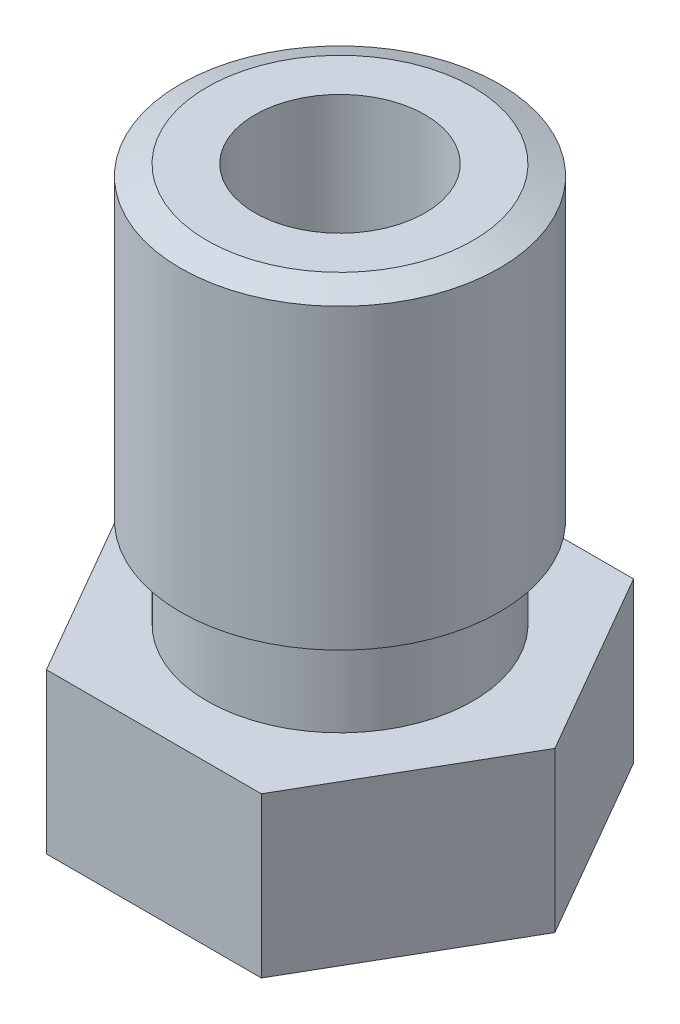
ISO-10303-21;
HEADER;
FILE_DESCRIPTION(('STEP AP214'),'2;1');
FILE_NAME('part.step','',(''),(''),'','','');
FILE_SCHEMA(('AUTOMOTIVE_DESIGN { 1 0 10303 214 1 1 1 1 }'));
ENDSEC;
DATA;
#1=APPLICATION_CONTEXT('core data for automotive mechanical design processes');
#2=APPLICATION_PROTOCOL_DEFINITION('international standard','automotive_design',2000,#1);
#3=PRODUCT_CONTEXT('',#1,'mechanical');
#4=PRODUCT('Part','Part','',(#3));
#5=PRODUCT_RELATED_PRODUCT_CATEGORY('part','',(#4));
#6=PRODUCT_DEFINITION_FORMATION('','',#4);
#7=PRODUCT_DEFINITION_CONTEXT('part definition',#1,'design');
#8=PRODUCT_DEFINITION('design','',#6,#7);
#9=PRODUCT_DEFINITION_SHAPE('','',#8);
#10=(LENGTH_UNIT() NAMED_UNIT(*) SI_UNIT(.MILLI.,.METRE.));
#11=(NAMED_UNIT(*) PLANE_ANGLE_UNIT() SI_UNIT($,.RADIAN.));
#12=(NAMED_UNIT(*) SI_UNIT($,.STERADIAN.) SOLID_ANGLE_UNIT());
#13=UNCERTAINTY_MEASURE_WITH_UNIT(LENGTH_MEASURE(1.E-05),#10,'distance_accuracy_value','');
#14=(GEOMETRIC_REPRESENTATION_CONTEXT(3) GLOBAL_UNCERTAINTY_ASSIGNED_CONTEXT((#13)) GLOBAL_UNIT_ASSIGNED_CONTEXT((#10,
#11,#12)) REPRESENTATION_CONTEXT('',''));
#15=CARTESIAN_POINT('',(0.,0.,0.));
#16=DIRECTION('',(0.,0.,1.));
#17=DIRECTION('',(1.,0.,0.));
#18=AXIS2_PLACEMENT_3D('',#15,#16,#17);
#19=CARTESIAN_POINT('',(3.5,5.,0.));
#20=DIRECTION('',(0.,1.,0.));
#21=DIRECTION('',(0.,0.,1.));
#22=AXIS2_PLACEMENT_3D('',#19,#20,#21);
#23=PLANE('',#22);
#24=CARTESIAN_POINT('',(0.,5.,0.));
#25=DIRECTION('',(0.,-1.,0.));
#26=DIRECTION('',(0.,0.,-1.));
#27=AXIS2_PLACEMENT_3D('',#24,#25,#26);
#28=CIRCLE('',#27,2.5);
#29=CARTESIAN_POINT('',(0.,5.,-2.5));
#30=VERTEX_POINT('',#29);
#31=EDGE_CURVE('E129',#30,#30,#28,.T.);
#32=ORIENTED_EDGE('',*,*,#31,.T.);
#33=EDGE_LOOP('',(#32));
#34=FACE_BOUND('',#33,.T.);
#35=DIRECTION('',(0.5,0.,-0.866025403784439));
#36=VECTOR('',#35,1.);
#37=CARTESIAN_POINT('',(2.02072594216369,5.,3.5));
#38=LINE('',#37,#36);
#39=CARTESIAN_POINT('',(2.02072594216369,5.,3.5));
#40=VERTEX_POINT('',#39);
#41=CARTESIAN_POINT('',(4.04145188432738,5.,0.));
#42=VERTEX_POINT('',#41);
#43=EDGE_CURVE('E109',#40,#42,#38,.T.);
#44=ORIENTED_EDGE('',*,*,#43,.T.);
#45=DIRECTION('',(-0.5,0.,-0.866025403784439));
#46=VECTOR('',#45,1.);
#47=CARTESIAN_POINT('',(4.04145188432738,5.,0.));
#48=LINE('',#47,#46);
#49=CARTESIAN_POINT('',(2.02072594216369,5.,-3.5));
#50=VERTEX_POINT('',#49);
#51=EDGE_CURVE('E102',#42,#50,#48,.T.);
#52=ORIENTED_EDGE('',*,*,#51,.T.);
#53=DIRECTION('',(-1.,0.,0.));
#54=VECTOR('',#53,1.);
#55=CARTESIAN_POINT('',(2.02072594216369,5.,-3.5));
#56=LINE('',#55,#54);
#57=CARTESIAN_POINT('',(-2.02072594216369,5.,-3.5));
#58=VERTEX_POINT('',#57);
#59=EDGE_CURVE('E50',#50,#58,#56,.T.);
#60=ORIENTED_EDGE('',*,*,#59,.T.);
#61=DIRECTION('',(-0.5,0.,0.866025403784439));
#62=VECTOR('',#61,1.);
#63=CARTESIAN_POINT('',(-2.02072594216369,5.,-3.5));
#64=LINE('',#63,#62);
#65=CARTESIAN_POINT('',(-4.04145188432738,5.,0.));
#66=VERTEX_POINT('',#65);
#67=EDGE_CURVE('E95',#58,#66,#64,.T.);
#68=ORIENTED_EDGE('',*,*,#67,.T.);
#69=DIRECTION('',(0.5,0.,0.866025403784439));
#70=VECTOR('',#69,1.);
#71=CARTESIAN_POINT('',(-4.04145188432738,5.,0.));
#72=LINE('',#71,#70);
#73=CARTESIAN_POINT('',(-2.02072594216369,5.,3.5));
#74=VERTEX_POINT('',#73);
#75=EDGE_CURVE('E89',#66,#74,#72,.T.);
#76=ORIENTED_EDGE('',*,*,#75,.T.);
#77=DIRECTION('',(1.,0.,0.));
#78=VECTOR('',#77,1.);
#79=CARTESIAN_POINT('',(-2.02072594216369,5.,3.5));
#80=LINE('',#79,#78);
#81=EDGE_CURVE('E232',#74,#40,#80,.T.);
#82=ORIENTED_EDGE('',*,*,#81,.T.);
#83=EDGE_LOOP('',(#44,#52,#60,#68,#76,#82));
#84=FACE_BOUND('',#83,.T.);
#85=ADVANCED_FACE('F33',(#34,#84),#23,.T.);
#86=CARTESIAN_POINT('',(0.,0.,0.));
#87=DIRECTION('',(0.,-1.,0.));
#88=DIRECTION('',(0.,0.,-1.));
#89=AXIS2_PLACEMENT_3D('',#86,#87,#88);
#90=CYLINDRICAL_SURFACE('',#89,2.5);
#91=CARTESIAN_POINT('',(0.,6.5,0.));
#92=DIRECTION('',(0.,-1.,0.));
#93=DIRECTION('',(0.,0.,-1.));
#94=AXIS2_PLACEMENT_3D('',#91,#92,#93);
#95=CIRCLE('',#94,2.5);
#96=CARTESIAN_POINT('',(0.,6.5,-2.5));
#97=VERTEX_POINT('',#96);
#98=EDGE_CURVE('E126',#97,#97,#95,.T.);
#99=ORIENTED_EDGE('',*,*,#98,.T.);
#100=EDGE_LOOP('',(#99));
#101=FACE_BOUND('',#100,.T.);
#102=ORIENTED_EDGE('',*,*,#31,.F.);
#103=EDGE_LOOP('',(#102));
#104=FACE_BOUND('',#103,.T.);
#105=ADVANCED_FACE('F150',(#101,#104),#90,.T.);
#106=CARTESIAN_POINT('',(0.,6.5,0.));
#107=DIRECTION('',(0.,1.,0.));
#108=DIRECTION('',(0.,0.,1.));
#109=AXIS2_PLACEMENT_3D('',#106,#107,#108);
#110=CONICAL_SURFACE('',#109,2.5,1.19028994968253);
#111=CARTESIAN_POINT('',(0.,6.7,0.));
#112=DIRECTION('',(0.,-1.,0.));
#113=DIRECTION('',(0.,0.,-1.));
#114=AXIS2_PLACEMENT_3D('',#111,#112,#113);
#115=CIRCLE('',#114,3.);
#116=CARTESIAN_POINT('',(0.,6.7,-3.));
#117=VERTEX_POINT('',#116);
#118=EDGE_CURVE('E123',#117,#117,#115,.T.);
#119=ORIENTED_EDGE('',*,*,#118,.T.);
#120=EDGE_LOOP('',(#119));
#121=FACE_BOUND('',#120,.T.);
#122=ORIENTED_EDGE('',*,*,#98,.F.);
#123=EDGE_LOOP('',(#122));
#124=FACE_BOUND('',#123,.T.);
#125=ADVANCED_FACE('F155',(#121,#124),#110,.T.);
#126=CARTESIAN_POINT('',(0.,0.,0.));
#127=DIRECTION('',(0.,-1.,0.));
#128=DIRECTION('',(0.,0.,-1.));
#129=AXIS2_PLACEMENT_3D('',#126,#127,#128);
#130=CYLINDRICAL_SURFACE('',#129,3.);
#131=CARTESIAN_POINT('',(0.,12.3,0.));
#132=DIRECTION('',(0.,-1.,0.));
#133=DIRECTION('',(0.,0.,-1.));
#134=AXIS2_PLACEMENT_3D('',#131,#132,#133);
#135=CIRCLE('',#134,3.);
#136=CARTESIAN_POINT('',(0.,12.3,-3.));
#137=VERTEX_POINT('',#136);
#138=EDGE_CURVE('E120',#137,#137,#135,.T.);
#139=ORIENTED_EDGE('',*,*,#138,.T.);
#140=EDGE_LOOP('',(#139));
#141=FACE_BOUND('',#140,.T.);
#142=ORIENTED_EDGE('',*,*,#118,.F.);
#143=EDGE_LOOP('',(#142));
#144=FACE_BOUND('',#143,.T.);
#145=ADVANCED_FACE('F161',(#141,#144),#130,.T.);
#146=CARTESIAN_POINT('',(0.,12.3,0.));
#147=DIRECTION('',(0.,-1.,0.));
#148=DIRECTION('',(0.,0.,-1.));
#149=AXIS2_PLACEMENT_3D('',#146,#147,#148);
#150=CONICAL_SURFACE('',#149,3.,1.19028994968253);
#151=CARTESIAN_POINT('',(0.,12.5,0.));
#152=DIRECTION('',(0.,-1.,0.));
#153=DIRECTION('',(0.,0.,-1.));
#154=AXIS2_PLACEMENT_3D('',#151,#152,#153);
#155=CIRCLE('',#154,2.5);
#156=CARTESIAN_POINT('',(0.,12.5,-2.5));
#157=VERTEX_POINT('',#156);
#158=EDGE_CURVE('E116',#157,#157,#155,.T.);
#159=ORIENTED_EDGE('',*,*,#158,.T.);
#160=EDGE_LOOP('',(#159));
#161=FACE_BOUND('',#160,.T.);
#162=ORIENTED_EDGE('',*,*,#138,.F.);
#163=EDGE_LOOP('',(#162));
#164=FACE_BOUND('',#163,.T.);
#165=ADVANCED_FACE('F165',(#161,#164),#150,.T.);
#166=CARTESIAN_POINT('',(2.5,12.5,0.));
#167=DIRECTION('',(0.,1.,0.));
#168=DIRECTION('',(0.,0.,1.));
#169=AXIS2_PLACEMENT_3D('',#166,#167,#168);
#170=PLANE('',#169);
#171=CARTESIAN_POINT('',(0.,12.5,0.));
#172=DIRECTION('',(0.,-1.,0.));
#173=DIRECTION('',(0.,0.,-1.));
#174=AXIS2_PLACEMENT_3D('',#171,#172,#173);
#175=CIRCLE('',#174,1.6);
#176=CARTESIAN_POINT('',(0.,12.5,-1.6));
#177=VERTEX_POINT('',#176);
#178=EDGE_CURVE('E212',#177,#177,#175,.T.);
#179=ORIENTED_EDGE('',*,*,#178,.T.);
#180=EDGE_LOOP('',(#179));
#181=FACE_BOUND('',#180,.T.);
#182=ORIENTED_EDGE('',*,*,#158,.F.);
#183=EDGE_LOOP('',(#182));
#184=FACE_BOUND('',#183,.T.);
#185=ADVANCED_FACE('F169',(#181,#184),#170,.T.);
#186=CARTESIAN_POINT('',(2.02072594216369,-8.69267662156363,-3.5));
#187=DIRECTION('',(0.,0.,-1.));
#188=DIRECTION('',(-1.,0.,0.));
#189=AXIS2_PLACEMENT_3D('',#186,#187,#188);
#190=PLANE('',#189);
#191=ORIENTED_EDGE('',*,*,#59,.F.);
#192=DIRECTION('',(0.,1.,0.));
#193=VECTOR('',#192,1.);
#194=CARTESIAN_POINT('',(2.02072594216369,-8.69267662156363,-3.5));
#195=LINE('',#194,#193);
#196=CARTESIAN_POINT('',(2.02072594216369,2.,-3.5));
#197=VERTEX_POINT('',#196);
#198=EDGE_CURVE('E114',#197,#50,#195,.T.);
#199=ORIENTED_EDGE('',*,*,#198,.F.);
#200=DIRECTION('',(-1.,0.,0.));
#201=VECTOR('',#200,1.);
#202=CARTESIAN_POINT('',(2.02072594216369,2.,-3.5));
#203=LINE('',#202,#201);
#204=CARTESIAN_POINT('',(-2.02072594216369,2.,-3.5));
#205=VERTEX_POINT('',#204);
#206=EDGE_CURVE('E106',#197,#205,#203,.T.);
#207=ORIENTED_EDGE('',*,*,#206,.T.);
#208=DIRECTION('',(0.,1.,0.));
#209=VECTOR('',#208,1.);
#210=CARTESIAN_POINT('',(-2.02072594216369,-8.69267662156363,-3.5));
#211=LINE('',#210,#209);
#212=EDGE_CURVE('E97',#205,#58,#211,.T.);
#213=ORIENTED_EDGE('',*,*,#212,.T.);
#214=EDGE_LOOP('',(#191,#199,#207,#213));
#215=FACE_BOUND('',#214,.T.);
#216=ADVANCED_FACE('F105',(#215),#190,.T.);
#217=CARTESIAN_POINT('',(-2.02072594216369,-8.69267662156363,-3.5));
#218=DIRECTION('',(-0.866025403784439,0.,-0.5));
#219=DIRECTION('',(-0.5,0.,0.866025403784439));
#220=AXIS2_PLACEMENT_3D('',#217,#218,#219);
#221=PLANE('',#220);
#222=ORIENTED_EDGE('',*,*,#67,.F.);
#223=ORIENTED_EDGE('',*,*,#212,.F.);
#224=DIRECTION('',(-0.5,0.,0.866025403784439));
#225=VECTOR('',#224,1.);
#226=CARTESIAN_POINT('',(-2.02072594216369,2.,-3.5));
#227=LINE('',#226,#225);
#228=CARTESIAN_POINT('',(-4.04145188432738,2.,0.));
#229=VERTEX_POINT('',#228);
#230=EDGE_CURVE('E77',#205,#229,#227,.T.);
#231=ORIENTED_EDGE('',*,*,#230,.T.);
#232=DIRECTION('',(0.,1.,0.));
#233=VECTOR('',#232,1.);
#234=CARTESIAN_POINT('',(-4.04145188432738,-8.69267662156363,0.));
#235=LINE('',#234,#233);
#236=EDGE_CURVE('E98',#229,#66,#235,.T.);
#237=ORIENTED_EDGE('',*,*,#236,.T.);
#238=EDGE_LOOP('',(#222,#223,#231,#237));
#239=FACE_BOUND('',#238,.T.);
#240=ADVANCED_FACE('F96',(#239),#221,.T.);
#241=CARTESIAN_POINT('',(-4.04145188432738,-8.69267662156363,0.));
#242=DIRECTION('',(-0.866025403784438,0.,0.5));
#243=DIRECTION('',(0.5,0.,0.866025403784439));
#244=AXIS2_PLACEMENT_3D('',#241,#242,#243);
#245=PLANE('',#244);
#246=ORIENTED_EDGE('',*,*,#75,.F.);
#247=ORIENTED_EDGE('',*,*,#236,.F.);
#248=DIRECTION('',(0.5,0.,0.866025403784439));
#249=VECTOR('',#248,1.);
#250=CARTESIAN_POINT('',(-4.04145188432738,2.,0.));
#251=LINE('',#250,#249);
#252=CARTESIAN_POINT('',(-2.02072594216369,2.,3.5));
#253=VERTEX_POINT('',#252);
#254=EDGE_CURVE('E73',#229,#253,#251,.T.);
#255=ORIENTED_EDGE('',*,*,#254,.T.);
#256=DIRECTION('',(0.,1.,0.));
#257=VECTOR('',#256,1.);
#258=CARTESIAN_POINT('',(-2.02072594216369,-8.69267662156363,3.5));
#259=LINE('',#258,#257);
#260=EDGE_CURVE('E246',#253,#74,#259,.T.);
#261=ORIENTED_EDGE('',*,*,#260,.T.);
#262=EDGE_LOOP('',(#246,#247,#255,#261));
#263=FACE_BOUND('',#262,.T.);
#264=ADVANCED_FACE('F178',(#263),#245,.T.);
#265=CARTESIAN_POINT('',(-2.02072594216369,-8.69267662156363,3.5));
#266=DIRECTION('',(0.,0.,1.));
#267=DIRECTION('',(1.,0.,0.));
#268=AXIS2_PLACEMENT_3D('',#265,#266,#267);
#269=PLANE('',#268);
#270=DIRECTION('',(0.,1.,0.));
#271=VECTOR('',#270,1.);
#272=CARTESIAN_POINT('',(2.02072594216369,-8.69267662156363,3.5));
#273=LINE('',#272,#271);
#274=CARTESIAN_POINT('',(2.02072594216369,2.,3.5));
#275=VERTEX_POINT('',#274);
#276=EDGE_CURVE('E242',#275,#40,#273,.T.);
#277=ORIENTED_EDGE('',*,*,#276,.T.);
#278=ORIENTED_EDGE('',*,*,#81,.F.);
#279=ORIENTED_EDGE('',*,*,#260,.F.);
#280=DIRECTION('',(1.,0.,0.));
#281=VECTOR('',#280,1.);
#282=CARTESIAN_POINT('',(-2.02072594216369,2.,3.5));
#283=LINE('',#282,#281);
#284=EDGE_CURVE('E243',#253,#275,#283,.T.);
#285=ORIENTED_EDGE('',*,*,#284,.T.);
#286=EDGE_LOOP('',(#277,#278,#279,#285));
#287=FACE_BOUND('',#286,.T.);
#288=ADVANCED_FACE('F181',(#287),#269,.T.);
#289=CARTESIAN_POINT('',(2.02072594216369,-8.69267662156363,3.5));
#290=DIRECTION('',(0.866025403784439,0.,0.5));
#291=DIRECTION('',(0.5,0.,-0.866025403784439));
#292=AXIS2_PLACEMENT_3D('',#289,#290,#291);
#293=PLANE('',#292);
#294=ORIENTED_EDGE('',*,*,#43,.F.);
#295=ORIENTED_EDGE('',*,*,#276,.F.);
#296=DIRECTION('',(0.5,0.,-0.866025403784439));
#297=VECTOR('',#296,1.);
#298=CARTESIAN_POINT('',(2.02072594216369,2.,3.5));
#299=LINE('',#298,#297);
#300=CARTESIAN_POINT('',(4.04145188432738,2.,0.));
#301=VERTEX_POINT('',#300);
#302=EDGE_CURVE('E239',#275,#301,#299,.T.);
#303=ORIENTED_EDGE('',*,*,#302,.T.);
#304=DIRECTION('',(0.,1.,0.));
#305=VECTOR('',#304,1.);
#306=CARTESIAN_POINT('',(4.04145188432738,-8.69267662156363,0.));
#307=LINE('',#306,#305);
#308=EDGE_CURVE('E238',#301,#42,#307,.T.);
#309=ORIENTED_EDGE('',*,*,#308,.T.);
#310=EDGE_LOOP('',(#294,#295,#303,#309));
#311=FACE_BOUND('',#310,.T.);
#312=ADVANCED_FACE('F184',(#311),#293,.T.);
#313=CARTESIAN_POINT('',(4.04145188432738,-8.69267662156363,0.));
#314=DIRECTION('',(0.866025403784438,0.,-0.5));
#315=DIRECTION('',(-0.5,0.,-0.866025403784439));
#316=AXIS2_PLACEMENT_3D('',#313,#314,#315);
#317=PLANE('',#316);
#318=ORIENTED_EDGE('',*,*,#51,.F.);
#319=ORIENTED_EDGE('',*,*,#308,.F.);
#320=DIRECTION('',(-0.5,0.,-0.866025403784439));
#321=VECTOR('',#320,1.);
#322=CARTESIAN_POINT('',(4.04145188432738,2.,0.));
#323=LINE('',#322,#321);
#324=EDGE_CURVE('E117',#301,#197,#323,.T.);
#325=ORIENTED_EDGE('',*,*,#324,.T.);
#326=ORIENTED_EDGE('',*,*,#198,.T.);
#327=EDGE_LOOP('',(#318,#319,#325,#326));
#328=FACE_BOUND('',#327,.T.);
#329=ADVANCED_FACE('F188',(#328),#317,.T.);
#330=CARTESIAN_POINT('',(0.,0.,0.));
#331=DIRECTION('',(0.,-1.,0.));
#332=DIRECTION('',(0.,0.,-1.));
#333=AXIS2_PLACEMENT_3D('',#330,#331,#332);
#334=PLANE('',#333);
#335=CARTESIAN_POINT('',(0.,0.,0.));
#336=DIRECTION('',(0.,-1.,0.));
#337=DIRECTION('',(0.,0.,-1.));
#338=AXIS2_PLACEMENT_3D('',#335,#336,#337);
#339=CIRCLE('',#338,0.2);
#340=CARTESIAN_POINT('',(0.,0.,-0.2));
#341=VERTEX_POINT('',#340);
#342=EDGE_CURVE('E228',#341,#341,#339,.T.);
#343=ORIENTED_EDGE('',*,*,#342,.F.);
#344=EDGE_LOOP('',(#343));
#345=FACE_BOUND('',#344,.T.);
#346=CARTESIAN_POINT('',(0.,0.,0.));
#347=DIRECTION('',(0.,-1.,0.));
#348=DIRECTION('',(0.,0.,-1.));
#349=AXIS2_PLACEMENT_3D('',#346,#347,#348);
#350=CIRCLE('',#349,0.5);
#351=CARTESIAN_POINT('',(0.,0.,0.5));
#352=VERTEX_POINT('',#351);
#353=EDGE_CURVE('E11',#352,#352,#350,.T.);
#354=ORIENTED_EDGE('',*,*,#353,.T.);
#355=EDGE_LOOP('',(#354));
#356=FACE_BOUND('',#355,.T.);
#357=ADVANCED_FACE('F35',(#345,#356),#334,.T.);
#358=CARTESIAN_POINT('',(0.,0.,0.));
#359=DIRECTION('',(0.,1.,0.));
#360=DIRECTION('',(0.,0.,1.));
#361=AXIS2_PLACEMENT_3D('',#358,#359,#360);
#362=CONICAL_SURFACE('',#361,0.5,0.610865238198013);
#363=CARTESIAN_POINT('',(0.,2.,0.));
#364=DIRECTION('',(0.,-1.,0.));
#365=DIRECTION('',(0.,0.,-1.));
#366=AXIS2_PLACEMENT_3D('',#363,#364,#365);
#367=CIRCLE('',#366,1.90041507641941);
#368=CARTESIAN_POINT('',(0.,2.,1.90041507641941));
#369=VERTEX_POINT('',#368);
#370=EDGE_CURVE('E42',#369,#369,#367,.T.);
#371=CARTESIAN_POINT('',(0.,2.,1.90041507641941));
#372=CARTESIAN_POINT('',(0.,1.97916666666667,1.88582741937338));
#373=CARTESIAN_POINT('',(0.,1.95833333333333,1.87123976232734));
#374=CARTESIAN_POINT('',(0.,1.91666666666667,1.84206444823527));
#375=CARTESIAN_POINT('',(0.,1.89583333333333,1.82747679118923));
#376=CARTESIAN_POINT('',(0.,1.85416666666667,1.79830147709716));
#377=CARTESIAN_POINT('',(0.,1.83333333333333,1.78371382005113));
#378=CARTESIAN_POINT('',(0.,1.79166666666667,1.75453850595906));
#379=CARTESIAN_POINT('',(0.,1.77083333333333,1.73995084891302));
#380=CARTESIAN_POINT('',(0.,1.72916666666667,1.71077553482095));
#381=CARTESIAN_POINT('',(0.,1.70833333333333,1.69618787777491));
#382=CARTESIAN_POINT('',(0.,1.66666666666667,1.66701256368284));
#383=CARTESIAN_POINT('',(0.,1.64583333333333,1.65242490663681));
#384=CARTESIAN_POINT('',(0.,1.60416666666667,1.62324959254474));
#385=CARTESIAN_POINT('',(0.,1.58333333333333,1.6086619354987));
#386=CARTESIAN_POINT('',(0.,1.54166666666667,1.57948662140663));
#387=CARTESIAN_POINT('',(0.,1.52083333333333,1.56489896436059));
#388=CARTESIAN_POINT('',(0.,1.47916666666667,1.53572365026852));
#389=CARTESIAN_POINT('',(0.,1.45833333333333,1.52113599322249));
#390=CARTESIAN_POINT('',(0.,1.41666666666667,1.49196067913042));
#391=CARTESIAN_POINT('',(0.,1.39583333333333,1.47737302208438));
#392=CARTESIAN_POINT('',(0.,1.35416666666667,1.44819770799231));
#393=CARTESIAN_POINT('',(0.,1.33333333333333,1.43361005094627));
#394=CARTESIAN_POINT('',(0.,1.29166666666667,1.4044347368542));
#395=CARTESIAN_POINT('',(0.,1.27083333333333,1.38984707980817));
#396=CARTESIAN_POINT('',(0.,1.22916666666667,1.3606717657161));
#397=CARTESIAN_POINT('',(0.,1.20833333333333,1.34608410867006));
#398=CARTESIAN_POINT('',(0.,1.16666666666667,1.31690879457799));
#399=CARTESIAN_POINT('',(0.,1.14583333333333,1.30232113753195));
#400=CARTESIAN_POINT('',(0.,1.10416666666667,1.27314582343988));
#401=CARTESIAN_POINT('',(0.,1.08333333333333,1.25855816639385));
#402=CARTESIAN_POINT('',(0.,1.04166666666667,1.22938285230178));
#403=CARTESIAN_POINT('',(0.,1.02083333333333,1.21479519525574));
#404=CARTESIAN_POINT('',(0.,0.979166666666667,1.18561988116367));
#405=CARTESIAN_POINT('',(0.,0.958333333333333,1.17103222411763));
#406=CARTESIAN_POINT('',(0.,0.916666666666667,1.14185691002556));
#407=CARTESIAN_POINT('',(0.,0.895833333333333,1.12726925297953));
#408=CARTESIAN_POINT('',(0.,0.854166666666667,1.09809393888746));
#409=CARTESIAN_POINT('',(0.,0.833333333333333,1.08350628184142));
#410=CARTESIAN_POINT('',(0.,0.791666666666667,1.05433096774935));
#411=CARTESIAN_POINT('',(0.,0.770833333333333,1.03974331070331));
#412=CARTESIAN_POINT('',(0.,0.729166666666667,1.01056799661124));
#413=CARTESIAN_POINT('',(0.,0.708333333333333,0.995980339565208));
#414=CARTESIAN_POINT('',(0.,0.666666666666667,0.966805025473137));
#415=CARTESIAN_POINT('',(0.,0.645833333333333,0.952217368427102));
#416=CARTESIAN_POINT('',(0.,0.604166666666667,0.923042054335031));
#417=CARTESIAN_POINT('',(0.,0.583333333333333,0.908454397288995));
#418=CARTESIAN_POINT('',(0.,0.541666666666667,0.879279083196924));
#419=CARTESIAN_POINT('',(0.,0.520833333333333,0.864691426150888));
#420=CARTESIAN_POINT('',(0.,0.479166666666667,0.835516112058817));
#421=CARTESIAN_POINT('',(0.,0.458333333333333,0.820928455012782));
#422=CARTESIAN_POINT('',(0.,0.416666666666667,0.791753140920711));
#423=CARTESIAN_POINT('',(0.,0.395833333333333,0.777165483874675));
#424=CARTESIAN_POINT('',(0.,0.354166666666667,0.747990169782604));
#425=CARTESIAN_POINT('',(0.,0.333333333333333,0.733402512736569));
#426=CARTESIAN_POINT('',(0.,0.291666666666667,0.704227198644498));
#427=CARTESIAN_POINT('',(0.,0.270833333333333,0.689639541598462));
#428=CARTESIAN_POINT('',(0.,0.229166666666667,0.660464227506391));
#429=CARTESIAN_POINT('',(0.,0.208333333333333,0.645876570460355));
#430=CARTESIAN_POINT('',(0.,0.166666666666667,0.616701256368284));
#431=CARTESIAN_POINT('',(0.,0.145833333333333,0.602113599322249));
#432=CARTESIAN_POINT('',(0.,0.104166666666667,0.572938285230178));
#433=CARTESIAN_POINT('',(0.,0.0833333333333334,0.558350628184142));
#434=CARTESIAN_POINT('',(0.,0.0416666666666667,0.529175314092071));
#435=CARTESIAN_POINT('',(0.,0.0208333333333334,0.514587657046035));
#436=CARTESIAN_POINT('',(0.,0.,0.5));
#437=B_SPLINE_CURVE_WITH_KNOTS('',3,(#371,#372,#373,#374,#375,#376,#377,#378,#379,#380,#381,
#382,#383,#384,#385,#386,#387,#388,#389,#390,#391,#392,#393,#394,#395,#396,#397,#398,#399,#400,
#401,#402,#403,#404,#405,#406,#407,#408,#409,#410,#411,#412,#413,#414,#415,#416,#417,#418,#419,
#420,#421,#422,#423,#424,#425,#426,#427,#428,#429,#430,#431,#432,#433,#434,#435,#436),
.UNSPECIFIED.,.F.,.F.,(4,2,2,2,2,2,2,2,2,2,2,2,2,2,2,2,2,2,2,2,2,2,2,2,2,2,2,2,2,2,2,2,4),(0.,
0.076298411797591,0.152596823595182,0.228895235392773,0.305193647190363,0.381492058987954,
0.457790470785545,0.534088882583136,0.610387294380727,0.686685706178318,0.762984117975909,
0.839282529773499,0.91558094157109,0.991879353368681,1.06817776516627,1.14447617696386,
1.22077458876145,1.29707300055904,1.37337141235664,1.44966982415423,1.52596823595182,
1.60226664774941,1.678565059547,1.75486347134459,1.83116188314218,1.90746029493977,
1.98375870673736,2.06005711853495,2.13635553033254,2.21265394213014,2.28895235392773,
2.36525076572532,2.44154917752291),.UNSPECIFIED.);
#438=EDGE_CURVE('BSEAM134',#369,#352,#437,.T.);
#439=ORIENTED_EDGE('',*,*,#370,.T.);
#440=ORIENTED_EDGE('',*,*,#353,.F.);
#441=ORIENTED_EDGE('',*,*,#438,.T.);
#442=ORIENTED_EDGE('',*,*,#438,.F.);
#443=EDGE_LOOP('',(#439,#441,#440,#442));
#444=FACE_BOUND('',#443,.T.);
#445=ADVANCED_FACE('F134',(#444),#362,.T.);
#446=CARTESIAN_POINT('',(1.90041507641941,2.,0.));
#447=DIRECTION('',(0.,-1.,0.));
#448=DIRECTION('',(0.,0.,-1.));
#449=AXIS2_PLACEMENT_3D('',#446,#447,#448);
#450=PLANE('',#449);
#451=ORIENTED_EDGE('',*,*,#230,.F.);
#452=ORIENTED_EDGE('',*,*,#206,.F.);
#453=ORIENTED_EDGE('',*,*,#324,.F.);
#454=ORIENTED_EDGE('',*,*,#302,.F.);
#455=ORIENTED_EDGE('',*,*,#284,.F.);
#456=ORIENTED_EDGE('',*,*,#254,.F.);
#457=EDGE_LOOP('',(#451,#452,#453,#454,#455,#456));
#458=FACE_BOUND('',#457,.T.);
#459=ORIENTED_EDGE('',*,*,#370,.F.);
#460=EDGE_LOOP('',(#459));
#461=FACE_BOUND('',#460,.T.);
#462=ADVANCED_FACE('F137',(#458,#461),#450,.T.);
#463=CARTESIAN_POINT('',(0.,0.,0.));
#464=DIRECTION('',(0.,-1.,0.));
#465=DIRECTION('',(0.,0.,-1.));
#466=AXIS2_PLACEMENT_3D('',#463,#464,#465);
#467=CYLINDRICAL_SURFACE('',#466,0.2);
#468=CARTESIAN_POINT('',(0.,0.8,0.));
#469=DIRECTION('',(0.,-1.,0.));
#470=DIRECTION('',(0.,0.,-1.));
#471=AXIS2_PLACEMENT_3D('',#468,#469,#470);
#472=CIRCLE('',#471,0.2);
#473=CARTESIAN_POINT('',(0.,0.8,0.2));
#474=VERTEX_POINT('',#473);
#475=EDGE_CURVE('E225',#474,#474,#472,.T.);
#476=ORIENTED_EDGE('',*,*,#475,.F.);
#477=EDGE_LOOP('',(#476));
#478=FACE_BOUND('',#477,.T.);
#479=ORIENTED_EDGE('',*,*,#342,.T.);
#480=EDGE_LOOP('',(#479));
#481=FACE_BOUND('',#480,.T.);
#482=ADVANCED_FACE('F139',(#478,#481),#467,.F.);
#483=CARTESIAN_POINT('',(0.,0.8,0.));
#484=DIRECTION('',(0.,1.,0.));
#485=DIRECTION('',(0.,0.,1.));
#486=AXIS2_PLACEMENT_3D('',#483,#484,#485);
#487=CONICAL_SURFACE('',#486,0.2,1.0471975511966);
#488=CARTESIAN_POINT('',(0.,1.11754264805429,0.));
#489=DIRECTION('',(0.,-1.,0.));
#490=DIRECTION('',(0.,0.,-1.));
#491=AXIS2_PLACEMENT_3D('',#488,#489,#490);
#492=CIRCLE('',#491,0.75);
#493=CARTESIAN_POINT('',(0.,1.11754264805429,0.75));
#494=VERTEX_POINT('',#493);
#495=EDGE_CURVE('E219',#494,#494,#492,.T.);
#496=CARTESIAN_POINT('',(0.,1.11754264805429,0.75));
#497=CARTESIAN_POINT('',(0.,1.11423491213706,0.744270833333333));
#498=CARTESIAN_POINT('',(0.,1.11092717621983,0.738541666666667));
#499=CARTESIAN_POINT('',(0.,1.10431170438536,0.727083333333334));
#500=CARTESIAN_POINT('',(0.,1.10100396846813,0.721354166666667));
#501=CARTESIAN_POINT('',(0.,1.09438849663367,0.709895833333334));
#502=CARTESIAN_POINT('',(0.,1.09108076071644,0.704166666666667));
#503=CARTESIAN_POINT('',(0.,1.08446528888197,0.692708333333333));
#504=CARTESIAN_POINT('',(0.,1.08115755296474,0.686979166666667));
#505=CARTESIAN_POINT('',(0.,1.07454208113027,0.675520833333334));
#506=CARTESIAN_POINT('',(0.,1.07123434521304,0.669791666666667));
#507=CARTESIAN_POINT('',(0.,1.06461887337858,0.658333333333333));
#508=CARTESIAN_POINT('',(0.,1.06131113746134,0.652604166666667));
#509=CARTESIAN_POINT('',(0.,1.05469566562688,0.641145833333334));
#510=CARTESIAN_POINT('',(0.,1.05138792970965,0.635416666666667));
#511=CARTESIAN_POINT('',(0.,1.04477245787518,0.623958333333334));
#512=CARTESIAN_POINT('',(0.,1.04146472195795,0.618229166666667));
#513=CARTESIAN_POINT('',(0.,1.03484925012349,0.606770833333333));
#514=CARTESIAN_POINT('',(0.,1.03154151420625,0.601041666666667));
#515=CARTESIAN_POINT('',(0.,1.02492604237179,0.589583333333333));
#516=CARTESIAN_POINT('',(0.,1.02161830645456,0.583854166666667));
#517=CARTESIAN_POINT('',(0.,1.01500283462009,0.572395833333334));
#518=CARTESIAN_POINT('',(0.,1.01169509870286,0.566666666666667));
#519=CARTESIAN_POINT('',(0.,1.0050796268684,0.555208333333333));
#520=CARTESIAN_POINT('',(0.,1.00177189095117,0.549479166666667));
#521=CARTESIAN_POINT('',(0.,0.995156419116701,0.538020833333334));
#522=CARTESIAN_POINT('',(0.,0.991848683199469,0.532291666666667));
#523=CARTESIAN_POINT('',(0.,0.985233211365004,0.520833333333333));
#524=CARTESIAN_POINT('',(0.,0.981925475447772,0.515104166666667));
#525=CARTESIAN_POINT('',(0.,0.975310003613307,0.503645833333333));
#526=CARTESIAN_POINT('',(0.,0.972002267696075,0.497916666666667));
#527=CARTESIAN_POINT('',(0.,0.965386795861611,0.486458333333333));
#528=CARTESIAN_POINT('',(0.,0.962079059944379,0.480729166666667));
#529=CARTESIAN_POINT('',(0.,0.955463588109914,0.469270833333334));
#530=CARTESIAN_POINT('',(0.,0.952155852192682,0.463541666666667));
#531=CARTESIAN_POINT('',(0.,0.945540380358218,0.452083333333334));
#532=CARTESIAN_POINT('',(0.,0.942232644440985,0.446354166666667));
#533=CARTESIAN_POINT('',(0.,0.935617172606521,0.434895833333334));
#534=CARTESIAN_POINT('',(0.,0.932309436689289,0.429166666666667));
#535=CARTESIAN_POINT('',(0.,0.925693964854824,0.417708333333334));
#536=CARTESIAN_POINT('',(0.,0.922386228937592,0.411979166666667));
#537=CARTESIAN_POINT('',(0.,0.915770757103128,0.400520833333333));
#538=CARTESIAN_POINT('',(0.,0.912463021185895,0.394791666666667));
#539=CARTESIAN_POINT('',(0.,0.905847549351431,0.383333333333334));
#540=CARTESIAN_POINT('',(0.,0.902539813434199,0.377604166666667));
#541=CARTESIAN_POINT('',(0.,0.895924341599734,0.366145833333333));
#542=CARTESIAN_POINT('',(0.,0.892616605682502,0.360416666666667));
#543=CARTESIAN_POINT('',(0.,0.886001133848038,0.348958333333333));
#544=CARTESIAN_POINT('',(0.,0.882693397930805,0.343229166666667));
#545=CARTESIAN_POINT('',(0.,0.876077926096341,0.331770833333333));
#546=CARTESIAN_POINT('',(0.,0.872770190179109,0.326041666666667));
#547=CARTESIAN_POINT('',(0.,0.866154718344644,0.314583333333333));
#548=CARTESIAN_POINT('',(0.,0.862846982427412,0.308854166666667));
#549=CARTESIAN_POINT('',(0.,0.856231510592948,0.297395833333333));
#550=CARTESIAN_POINT('',(0.,0.852923774675716,0.291666666666667));
#551=CARTESIAN_POINT('',(0.,0.846308302841251,0.280208333333334));
#552=CARTESIAN_POINT('',(0.,0.843000566924019,0.274479166666667));
#553=CARTESIAN_POINT('',(0.,0.836385095089554,0.263020833333333));
#554=CARTESIAN_POINT('',(0.,0.833077359172322,0.257291666666667));
#555=CARTESIAN_POINT('',(0.,0.826461887337858,0.245833333333333));
#556=CARTESIAN_POINT('',(0.,0.823154151420626,0.240104166666667));
#557=CARTESIAN_POINT('',(0.,0.816538679586161,0.228645833333333));
#558=CARTESIAN_POINT('',(0.,0.813230943668929,0.222916666666667));
#559=CARTESIAN_POINT('',(0.,0.806615471834464,0.211458333333333));
#560=CARTESIAN_POINT('',(0.,0.803307735917232,0.205729166666667));
#561=CARTESIAN_POINT('',(0.,0.8,0.2));
#562=B_SPLINE_CURVE_WITH_KNOTS('',3,(#496,#497,#498,#499,#500,#501,#502,#503,#504,#505,#506,
#507,#508,#509,#510,#511,#512,#513,#514,#515,#516,#517,#518,#519,#520,#521,#522,#523,#524,#525,
#526,#527,#528,#529,#530,#531,#532,#533,#534,#535,#536,#537,#538,#539,#540,#541,#542,#543,#544,
#545,#546,#547,#548,#549,#550,#551,#552,#553,#554,#555,#556,#557,#558,#559,#560,#561),
.UNSPECIFIED.,.F.,.F.,(4,2,2,2,2,2,2,2,2,2,2,2,2,2,2,2,2,2,2,2,2,2,2,2,2,2,2,2,2,2,2,2,4),(0.,
0.0198464155033933,0.0396928310067867,0.05953924651018,0.0793856620135734,0.0992320775169668,
0.11907849302036,0.138924908523753,0.158771324027147,0.17861773953054,0.198464155033934,
0.218310570537327,0.23815698604072,0.258003401544114,0.277849817047507,0.2976962325509,
0.317542648054294,0.337389063557687,0.357235479061081,0.377081894564474,0.396928310067867,
0.416774725571261,0.436621141074654,0.456467556578047,0.476313972081441,0.496160387584834,
0.516006803088227,0.535853218591621,0.555699634095014,0.575546049598407,0.595392465101801,
0.615238880605194,0.635085296108588),.UNSPECIFIED.);
#563=EDGE_CURVE('BSEAM145',#494,#474,#562,.T.);
#564=ORIENTED_EDGE('',*,*,#495,.F.);
#565=ORIENTED_EDGE('',*,*,#475,.T.);
#566=ORIENTED_EDGE('',*,*,#563,.T.);
#567=ORIENTED_EDGE('',*,*,#563,.F.);
#568=EDGE_LOOP('',(#564,#566,#565,#567));
#569=FACE_BOUND('',#568,.T.);
#570=ADVANCED_FACE('F145',(#569),#487,.F.);
#571=CARTESIAN_POINT('',(0.,0.,0.));
#572=DIRECTION('',(0.,-1.,0.));
#573=DIRECTION('',(0.,0.,-1.));
#574=AXIS2_PLACEMENT_3D('',#571,#572,#573);
#575=CYLINDRICAL_SURFACE('',#574,0.75);
#576=CARTESIAN_POINT('',(0.,1.90925227118882,0.));
#577=DIRECTION('',(0.,-1.,0.));
#578=DIRECTION('',(0.,0.,-1.));
#579=AXIS2_PLACEMENT_3D('',#576,#577,#578);
#580=CIRCLE('',#579,0.75);
#581=CARTESIAN_POINT('',(0.,1.90925227118882,-0.75));
#582=VERTEX_POINT('',#581);
#583=EDGE_CURVE('E216',#582,#582,#580,.T.);
#584=ORIENTED_EDGE('',*,*,#583,.F.);
#585=EDGE_LOOP('',(#584));
#586=FACE_BOUND('',#585,.T.);
#587=ORIENTED_EDGE('',*,*,#495,.T.);
#588=EDGE_LOOP('',(#587));
#589=FACE_BOUND('',#588,.T.);
#590=ADVANCED_FACE('F195',(#586,#589),#575,.F.);
#591=CARTESIAN_POINT('',(0.,1.90925227118882,0.));
#592=DIRECTION('',(0.,1.,0.));
#593=DIRECTION('',(0.,0.,1.));
#594=AXIS2_PLACEMENT_3D('',#591,#592,#593);
#595=CONICAL_SURFACE('',#594,0.75,1.0471975511966);
#596=CARTESIAN_POINT('',(0.,2.4,0.));
#597=DIRECTION('',(0.,-1.,0.));
#598=DIRECTION('',(0.,0.,-1.));
#599=AXIS2_PLACEMENT_3D('',#596,#597,#598);
#600=CIRCLE('',#599,1.6);
#601=CARTESIAN_POINT('',(0.,2.4,-1.6));
#602=VERTEX_POINT('',#601);
#603=EDGE_CURVE('E215',#602,#602,#600,.T.);
#604=ORIENTED_EDGE('',*,*,#603,.F.);
#605=EDGE_LOOP('',(#604));
#606=FACE_BOUND('',#605,.T.);
#607=ORIENTED_EDGE('',*,*,#583,.T.);
#608=EDGE_LOOP('',(#607));
#609=FACE_BOUND('',#608,.T.);
#610=ADVANCED_FACE('F199',(#606,#609),#595,.F.);
#611=CARTESIAN_POINT('',(0.,0.,0.));
#612=DIRECTION('',(0.,-1.,0.));
#613=DIRECTION('',(0.,0.,-1.));
#614=AXIS2_PLACEMENT_3D('',#611,#612,#613);
#615=CYLINDRICAL_SURFACE('',#614,1.6);
#616=ORIENTED_EDGE('',*,*,#178,.F.);
#617=EDGE_LOOP('',(#616));
#618=FACE_BOUND('',#617,.T.);
#619=ORIENTED_EDGE('',*,*,#603,.T.);
#620=EDGE_LOOP('',(#619));
#621=FACE_BOUND('',#620,.T.);
#622=ADVANCED_FACE('F203',(#618,#621),#615,.F.);
#623=CLOSED_SHELL('',(#85,#105,#125,#145,#165,#185,#216,#240,#264,#288,#312,#329,#357,#445,#462,
#482,#570,#590,#610,#622));
#624=MANIFOLD_SOLID_BREP('B2',#623);
#625=ADVANCED_BREP_SHAPE_REPRESENTATION('',(#18,#624),#14);
#626=SHAPE_DEFINITION_REPRESENTATION(#9,#625);
ENDSEC;
END-ISO-10303-21;
